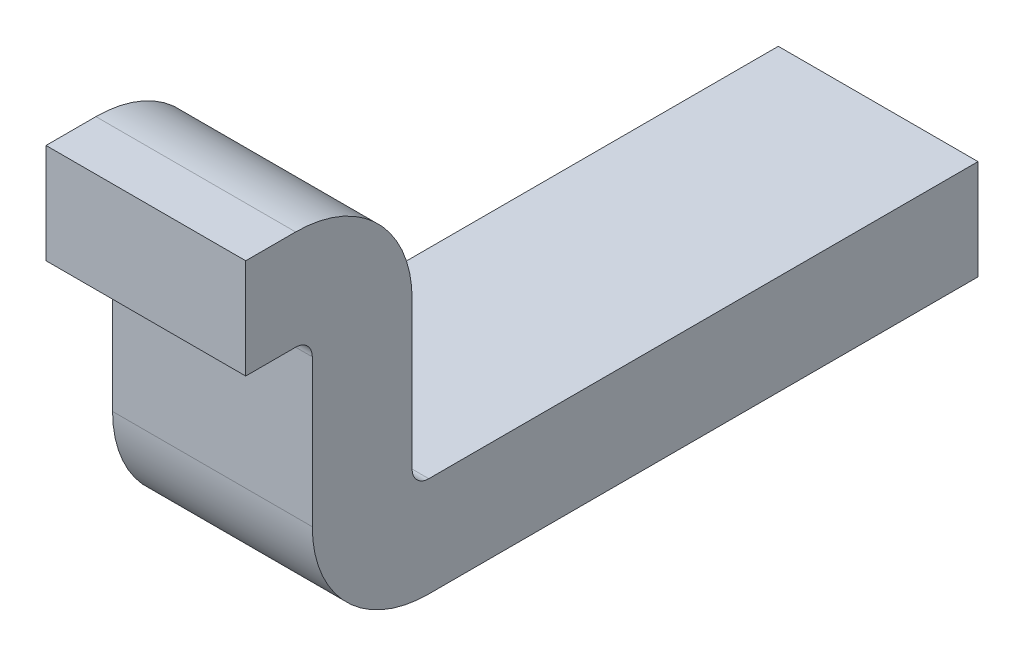
ISO-10303-21;
HEADER;
FILE_DESCRIPTION(('STEP AP214'),'2;1');
FILE_NAME('part.step','',(''),(''),'','','');
FILE_SCHEMA(('AUTOMOTIVE_DESIGN { 1 0 10303 214 1 1 1 1 }'));
ENDSEC;
DATA;
#1=APPLICATION_CONTEXT('core data for automotive mechanical design processes');
#2=APPLICATION_PROTOCOL_DEFINITION('international standard','automotive_design',2000,#1);
#3=PRODUCT_CONTEXT('',#1,'mechanical');
#4=PRODUCT('Part','Part','',(#3));
#5=PRODUCT_RELATED_PRODUCT_CATEGORY('part','',(#4));
#6=PRODUCT_DEFINITION_FORMATION('','',#4);
#7=PRODUCT_DEFINITION_CONTEXT('part definition',#1,'design');
#8=PRODUCT_DEFINITION('design','',#6,#7);
#9=PRODUCT_DEFINITION_SHAPE('','',#8);
#10=(LENGTH_UNIT() NAMED_UNIT(*) SI_UNIT(.MILLI.,.METRE.));
#11=(NAMED_UNIT(*) PLANE_ANGLE_UNIT() SI_UNIT($,.RADIAN.));
#12=(NAMED_UNIT(*) SI_UNIT($,.STERADIAN.) SOLID_ANGLE_UNIT());
#13=UNCERTAINTY_MEASURE_WITH_UNIT(LENGTH_MEASURE(1.E-05),#10,'distance_accuracy_value','');
#14=(GEOMETRIC_REPRESENTATION_CONTEXT(3) GLOBAL_UNCERTAINTY_ASSIGNED_CONTEXT((#13)) GLOBAL_UNIT_ASSIGNED_CONTEXT((#10,
#11,#12)) REPRESENTATION_CONTEXT('',''));
#15=CARTESIAN_POINT('',(0.,0.,0.));
#16=DIRECTION('',(0.,0.,1.));
#17=DIRECTION('',(1.,0.,0.));
#18=AXIS2_PLACEMENT_3D('',#15,#16,#17);
#19=CARTESIAN_POINT('',(2.04999999999999,4.55000000000001,-4.015));
#20=DIRECTION('',(0.,-1.,0.));
#21=DIRECTION('',(0.,0.,-1.));
#22=AXIS2_PLACEMENT_3D('',#19,#20,#21);
#23=PLANE('',#22);
#24=DIRECTION('',(1.,0.,0.));
#25=VECTOR('',#24,1.);
#26=CARTESIAN_POINT('',(2.04999999999999,4.55000000000001,-4.83999999999999));
#27=LINE('',#26,#25);
#28=CARTESIAN_POINT('',(2.04999999999999,4.55000000000001,-4.83999999999999));
#29=VERTEX_POINT('',#28);
#30=CARTESIAN_POINT('',(2.34999999999999,4.55000000000001,-4.83999999999999));
#31=VERTEX_POINT('',#30);
#32=EDGE_CURVE('E11',#29,#31,#27,.T.);
#33=ORIENTED_EDGE('',*,*,#32,.F.);
#34=DIRECTION('',(0.,0.,-1.));
#35=VECTOR('',#34,1.);
#36=CARTESIAN_POINT('',(2.04999999999999,4.55000000000001,-4.015));
#37=LINE('',#36,#35);
#38=CARTESIAN_POINT('',(2.04999999999999,4.55000000000001,-4.015));
#39=VERTEX_POINT('',#38);
#40=EDGE_CURVE('E24',#39,#29,#37,.T.);
#41=ORIENTED_EDGE('',*,*,#40,.F.);
#42=DIRECTION('',(-1.,0.,0.));
#43=VECTOR('',#42,1.);
#44=CARTESIAN_POINT('',(2.04999999999999,4.55000000000001,-4.015));
#45=LINE('',#44,#43);
#46=CARTESIAN_POINT('',(2.34999999999999,4.55000000000001,-4.015));
#47=VERTEX_POINT('',#46);
#48=EDGE_CURVE('E196',#47,#39,#45,.T.);
#49=ORIENTED_EDGE('',*,*,#48,.F.);
#50=DIRECTION('',(0.,0.,1.));
#51=VECTOR('',#50,1.);
#52=CARTESIAN_POINT('',(2.34999999999999,4.55000000000001,-4.015));
#53=LINE('',#52,#51);
#54=EDGE_CURVE('E193',#31,#47,#53,.T.);
#55=ORIENTED_EDGE('',*,*,#54,.F.);
#56=EDGE_LOOP('',(#33,#41,#49,#55));
#57=FACE_BOUND('',#56,.T.);
#58=ADVANCED_FACE('F17',(#57),#23,.F.);
#59=CARTESIAN_POINT('',(2.34999999999999,4.79600850144757,-3.81499999999999));
#60=DIRECTION('',(-1.,0.,0.));
#61=DIRECTION('',(0.,0.,1.));
#62=AXIS2_PLACEMENT_3D('',#59,#60,#61);
#63=PLANE('',#62);
#64=DIRECTION('',(0.,0.,1.));
#65=VECTOR('',#64,1.);
#66=CARTESIAN_POINT('',(2.34999999999999,4.82100850144757,-3.81499999999999));
#67=LINE('',#66,#65);
#68=CARTESIAN_POINT('',(2.34999999999999,4.82100850144757,-3.81499999999999));
#69=VERTEX_POINT('',#68);
#70=CARTESIAN_POINT('',(2.34999999999999,4.82100850144757,-3.73999999999999));
#71=VERTEX_POINT('',#70);
#72=EDGE_CURVE('E191',#69,#71,#67,.T.);
#73=ORIENTED_EDGE('',*,*,#72,.F.);
#74=CARTESIAN_POINT('',(2.34999999999999,4.79600850144757,-3.81499999999999));
#75=DIRECTION('',(-1.,0.,0.));
#76=DIRECTION('',(0.,0.,-1.));
#77=AXIS2_PLACEMENT_3D('',#74,#75,#76);
#78=CIRCLE('',#77,0.0249999999999998);
#79=CARTESIAN_POINT('',(2.34999999999999,4.79600850144757,-3.83999999999999));
#80=VERTEX_POINT('',#79);
#81=EDGE_CURVE('E189',#69,#80,#78,.T.);
#82=ORIENTED_EDGE('',*,*,#81,.T.);
#83=DIRECTION('',(0.,1.,0.));
#84=VECTOR('',#83,1.);
#85=CARTESIAN_POINT('',(2.34999999999999,4.79600850144757,-3.83999999999999));
#86=LINE('',#85,#84);
#87=CARTESIAN_POINT('',(2.34999999999999,4.57500000000001,-3.83999999999999));
#88=VERTEX_POINT('',#87);
#89=EDGE_CURVE('E187',#88,#80,#86,.T.);
#90=ORIENTED_EDGE('',*,*,#89,.F.);
#91=CARTESIAN_POINT('',(2.34999999999999,4.57500000000001,-4.015));
#92=DIRECTION('',(-1.,0.,0.));
#93=DIRECTION('',(0.,0.,-1.));
#94=AXIS2_PLACEMENT_3D('',#91,#92,#93);
#95=CIRCLE('',#94,0.175000000000001);
#96=CARTESIAN_POINT('',(2.34999999999999,4.40000000000001,-4.015));
#97=VERTEX_POINT('',#96);
#98=EDGE_CURVE('E126',#97,#88,#95,.T.);
#99=ORIENTED_EDGE('',*,*,#98,.F.);
#100=DIRECTION('',(0.,0.,1.));
#101=VECTOR('',#100,1.);
#102=CARTESIAN_POINT('',(2.34999999999999,4.40000000000001,-3.81499999999999));
#103=LINE('',#102,#101);
#104=CARTESIAN_POINT('',(2.34999999999999,4.40000000000001,-4.83999999999999));
#105=VERTEX_POINT('',#104);
#106=EDGE_CURVE('E183',#105,#97,#103,.T.);
#107=ORIENTED_EDGE('',*,*,#106,.F.);
#108=DIRECTION('',(0.,-1.,0.));
#109=VECTOR('',#108,1.);
#110=CARTESIAN_POINT('',(2.34999999999999,4.79600850144757,-4.83999999999999));
#111=LINE('',#110,#109);
#112=EDGE_CURVE('E181',#31,#105,#111,.T.);
#113=ORIENTED_EDGE('',*,*,#112,.F.);
#114=ORIENTED_EDGE('',*,*,#54,.T.);
#115=CARTESIAN_POINT('',(2.34999999999999,4.57500000000001,-4.015));
#116=DIRECTION('',(1.,0.,0.));
#117=DIRECTION('',(0.,0.,-1.));
#118=AXIS2_PLACEMENT_3D('',#115,#116,#117);
#119=CIRCLE('',#118,0.0250000000000007);
#120=CARTESIAN_POINT('',(2.34999999999999,4.57500000000001,-3.98999999999999));
#121=VERTEX_POINT('',#120);
#122=EDGE_CURVE('E178',#121,#47,#119,.T.);
#123=ORIENTED_EDGE('',*,*,#122,.F.);
#124=DIRECTION('',(0.,-1.,0.));
#125=VECTOR('',#124,1.);
#126=CARTESIAN_POINT('',(2.34999999999999,4.79600850144757,-3.98999999999999));
#127=LINE('',#126,#125);
#128=CARTESIAN_POINT('',(2.34999999999999,4.79600850144757,-3.98999999999999));
#129=VERTEX_POINT('',#128);
#130=EDGE_CURVE('E175',#129,#121,#127,.T.);
#131=ORIENTED_EDGE('',*,*,#130,.F.);
#132=CARTESIAN_POINT('',(2.34999999999999,4.79600850144757,-3.81499999999999));
#133=DIRECTION('',(-1.,0.,0.));
#134=DIRECTION('',(0.,0.,-1.));
#135=AXIS2_PLACEMENT_3D('',#132,#133,#134);
#136=CIRCLE('',#135,0.175000000000001);
#137=CARTESIAN_POINT('',(2.34999999999999,4.97100850144757,-3.81499999999999));
#138=VERTEX_POINT('',#137);
#139=EDGE_CURVE('E172',#138,#129,#136,.T.);
#140=ORIENTED_EDGE('',*,*,#139,.F.);
#141=DIRECTION('',(0.,0.,-1.));
#142=VECTOR('',#141,1.);
#143=CARTESIAN_POINT('',(2.34999999999999,4.97100850144757,-3.81499999999999));
#144=LINE('',#143,#142);
#145=CARTESIAN_POINT('',(2.34999999999999,4.97100850144757,-3.73999999999999));
#146=VERTEX_POINT('',#145);
#147=EDGE_CURVE('E169',#146,#138,#144,.T.);
#148=ORIENTED_EDGE('',*,*,#147,.F.);
#149=DIRECTION('',(0.,1.,0.));
#150=VECTOR('',#149,1.);
#151=CARTESIAN_POINT('',(2.34999999999999,4.79600850144757,-3.73999999999999));
#152=LINE('',#151,#150);
#153=EDGE_CURVE('E166',#71,#146,#152,.T.);
#154=ORIENTED_EDGE('',*,*,#153,.F.);
#155=EDGE_LOOP('',(#73,#82,#90,#99,#107,#113,#114,#123,#131,#140,#148,#154));
#156=FACE_BOUND('',#155,.T.);
#157=ADVANCED_FACE('F204',(#156),#63,.F.);
#158=CARTESIAN_POINT('',(2.04999999999999,4.55000000000001,-4.83999999999999));
#159=DIRECTION('',(0.,0.,1.));
#160=DIRECTION('',(1.,0.,0.));
#161=AXIS2_PLACEMENT_3D('',#158,#159,#160);
#162=PLANE('',#161);
#163=DIRECTION('',(1.,0.,0.));
#164=VECTOR('',#163,1.);
#165=CARTESIAN_POINT('',(2.04999999999999,4.40000000000001,-4.83999999999999));
#166=LINE('',#165,#164);
#167=CARTESIAN_POINT('',(2.04999999999999,4.40000000000001,-4.83999999999999));
#168=VERTEX_POINT('',#167);
#169=EDGE_CURVE('E163',#168,#105,#166,.T.);
#170=ORIENTED_EDGE('',*,*,#169,.F.);
#171=DIRECTION('',(0.,-1.,0.));
#172=VECTOR('',#171,1.);
#173=CARTESIAN_POINT('',(2.04999999999999,4.55000000000001,-4.83999999999999));
#174=LINE('',#173,#172);
#175=EDGE_CURVE('E161',#29,#168,#174,.T.);
#176=ORIENTED_EDGE('',*,*,#175,.F.);
#177=ORIENTED_EDGE('',*,*,#32,.T.);
#178=ORIENTED_EDGE('',*,*,#112,.T.);
#179=EDGE_LOOP('',(#170,#176,#177,#178));
#180=FACE_BOUND('',#179,.T.);
#181=ADVANCED_FACE('F199',(#180),#162,.F.);
#182=CARTESIAN_POINT('',(2.04999999999999,4.79600850144757,-3.81499999999999));
#183=DIRECTION('',(-1.,0.,0.));
#184=DIRECTION('',(0.,0.,1.));
#185=AXIS2_PLACEMENT_3D('',#182,#183,#184);
#186=PLANE('',#185);
#187=CARTESIAN_POINT('',(2.04999999999999,4.79600850144757,-3.81499999999999));
#188=DIRECTION('',(1.,0.,0.));
#189=DIRECTION('',(0.,0.,-1.));
#190=AXIS2_PLACEMENT_3D('',#187,#188,#189);
#191=CIRCLE('',#190,0.0249999999999998);
#192=CARTESIAN_POINT('',(2.04999999999999,4.79600850144757,-3.83999999999999));
#193=VERTEX_POINT('',#192);
#194=CARTESIAN_POINT('',(2.04999999999999,4.82100850144757,-3.81499999999999));
#195=VERTEX_POINT('',#194);
#196=EDGE_CURVE('E159',#193,#195,#191,.T.);
#197=ORIENTED_EDGE('',*,*,#196,.T.);
#198=DIRECTION('',(0.,0.,1.));
#199=VECTOR('',#198,1.);
#200=CARTESIAN_POINT('',(2.04999999999999,4.82100850144757,-3.81499999999999));
#201=LINE('',#200,#199);
#202=CARTESIAN_POINT('',(2.04999999999999,4.82100850144757,-3.73999999999999));
#203=VERTEX_POINT('',#202);
#204=EDGE_CURVE('E157',#195,#203,#201,.T.);
#205=ORIENTED_EDGE('',*,*,#204,.T.);
#206=DIRECTION('',(0.,1.,0.));
#207=VECTOR('',#206,1.);
#208=CARTESIAN_POINT('',(2.04999999999999,4.79600850144757,-3.73999999999999));
#209=LINE('',#208,#207);
#210=CARTESIAN_POINT('',(2.04999999999999,4.97100850144757,-3.73999999999999));
#211=VERTEX_POINT('',#210);
#212=EDGE_CURVE('E155',#203,#211,#209,.T.);
#213=ORIENTED_EDGE('',*,*,#212,.T.);
#214=DIRECTION('',(0.,0.,-1.));
#215=VECTOR('',#214,1.);
#216=CARTESIAN_POINT('',(2.04999999999999,4.97100850144757,-3.81499999999999));
#217=LINE('',#216,#215);
#218=CARTESIAN_POINT('',(2.04999999999999,4.97100850144757,-3.81499999999999));
#219=VERTEX_POINT('',#218);
#220=EDGE_CURVE('E153',#211,#219,#217,.T.);
#221=ORIENTED_EDGE('',*,*,#220,.T.);
#222=CARTESIAN_POINT('',(2.04999999999999,4.79600850144757,-3.81499999999999));
#223=DIRECTION('',(-1.,0.,0.));
#224=DIRECTION('',(0.,0.,-1.));
#225=AXIS2_PLACEMENT_3D('',#222,#223,#224);
#226=CIRCLE('',#225,0.175000000000001);
#227=CARTESIAN_POINT('',(2.04999999999999,4.79600850144757,-3.98999999999999));
#228=VERTEX_POINT('',#227);
#229=EDGE_CURVE('E151',#219,#228,#226,.T.);
#230=ORIENTED_EDGE('',*,*,#229,.T.);
#231=DIRECTION('',(0.,-1.,0.));
#232=VECTOR('',#231,1.);
#233=CARTESIAN_POINT('',(2.04999999999999,4.79600850144757,-3.98999999999999));
#234=LINE('',#233,#232);
#235=CARTESIAN_POINT('',(2.04999999999999,4.57500000000001,-3.98999999999999));
#236=VERTEX_POINT('',#235);
#237=EDGE_CURVE('E149',#228,#236,#234,.T.);
#238=ORIENTED_EDGE('',*,*,#237,.T.);
#239=CARTESIAN_POINT('',(2.04999999999999,4.57500000000001,-4.015));
#240=DIRECTION('',(1.,0.,0.));
#241=DIRECTION('',(0.,0.,-1.));
#242=AXIS2_PLACEMENT_3D('',#239,#240,#241);
#243=CIRCLE('',#242,0.0250000000000007);
#244=EDGE_CURVE('E146',#236,#39,#243,.T.);
#245=ORIENTED_EDGE('',*,*,#244,.T.);
#246=ORIENTED_EDGE('',*,*,#40,.T.);
#247=ORIENTED_EDGE('',*,*,#175,.T.);
#248=DIRECTION('',(0.,0.,1.));
#249=VECTOR('',#248,1.);
#250=CARTESIAN_POINT('',(2.04999999999999,4.40000000000001,-3.81499999999999));
#251=LINE('',#250,#249);
#252=CARTESIAN_POINT('',(2.04999999999999,4.40000000000001,-4.015));
#253=VERTEX_POINT('',#252);
#254=EDGE_CURVE('E109',#168,#253,#251,.T.);
#255=ORIENTED_EDGE('',*,*,#254,.T.);
#256=CARTESIAN_POINT('',(2.04999999999999,4.57500000000001,-4.015));
#257=DIRECTION('',(-1.,0.,0.));
#258=DIRECTION('',(0.,0.,-1.));
#259=AXIS2_PLACEMENT_3D('',#256,#257,#258);
#260=CIRCLE('',#259,0.175000000000001);
#261=CARTESIAN_POINT('',(2.04999999999999,4.57500000000001,-3.83999999999999));
#262=VERTEX_POINT('',#261);
#263=EDGE_CURVE('E102',#253,#262,#260,.T.);
#264=ORIENTED_EDGE('',*,*,#263,.T.);
#265=DIRECTION('',(0.,1.,0.));
#266=VECTOR('',#265,1.);
#267=CARTESIAN_POINT('',(2.04999999999999,4.79600850144757,-3.83999999999999));
#268=LINE('',#267,#266);
#269=EDGE_CURVE('E105',#262,#193,#268,.T.);
#270=ORIENTED_EDGE('',*,*,#269,.T.);
#271=EDGE_LOOP('',(#197,#205,#213,#221,#230,#238,#245,#246,#247,#255,#264,#270));
#272=FACE_BOUND('',#271,.T.);
#273=ADVANCED_FACE('F104',(#272),#186,.T.);
#274=CARTESIAN_POINT('',(2.04999999999999,4.57500000000001,-4.015));
#275=DIRECTION('',(1.,0.,0.));
#276=DIRECTION('',(0.,0.,-1.));
#277=AXIS2_PLACEMENT_3D('',#274,#275,#276);
#278=CYLINDRICAL_SURFACE('',#277,0.0250000000000007);
#279=ORIENTED_EDGE('',*,*,#48,.T.);
#280=ORIENTED_EDGE('',*,*,#244,.F.);
#281=DIRECTION('',(-1.,0.,0.));
#282=VECTOR('',#281,1.);
#283=CARTESIAN_POINT('',(2.04999999999999,4.57500000000001,-3.98999999999999));
#284=LINE('',#283,#282);
#285=EDGE_CURVE('E122',#121,#236,#284,.T.);
#286=ORIENTED_EDGE('',*,*,#285,.F.);
#287=ORIENTED_EDGE('',*,*,#122,.T.);
#288=EDGE_LOOP('',(#279,#280,#286,#287));
#289=FACE_BOUND('',#288,.T.);
#290=ADVANCED_FACE('F235',(#289),#278,.F.);
#291=CARTESIAN_POINT('',(2.04999999999999,4.82100850144757,-3.73999999999999));
#292=DIRECTION('',(0.,0.,-1.));
#293=DIRECTION('',(-1.,0.,0.));
#294=AXIS2_PLACEMENT_3D('',#291,#292,#293);
#295=PLANE('',#294);
#296=DIRECTION('',(1.,0.,0.));
#297=VECTOR('',#296,1.);
#298=CARTESIAN_POINT('',(2.04999999999999,4.97100850144757,-3.73999999999999));
#299=LINE('',#298,#297);
#300=EDGE_CURVE('E140',#211,#146,#299,.T.);
#301=ORIENTED_EDGE('',*,*,#300,.F.);
#302=ORIENTED_EDGE('',*,*,#212,.F.);
#303=DIRECTION('',(-1.,0.,0.));
#304=VECTOR('',#303,1.);
#305=CARTESIAN_POINT('',(2.04999999999999,4.82100850144757,-3.73999999999999));
#306=LINE('',#305,#304);
#307=EDGE_CURVE('E137',#71,#203,#306,.T.);
#308=ORIENTED_EDGE('',*,*,#307,.F.);
#309=ORIENTED_EDGE('',*,*,#153,.T.);
#310=EDGE_LOOP('',(#301,#302,#308,#309));
#311=FACE_BOUND('',#310,.T.);
#312=ADVANCED_FACE('F217',(#311),#295,.F.);
#313=CARTESIAN_POINT('',(2.04999999999999,4.82100850144757,-3.81499999999999));
#314=DIRECTION('',(0.,1.,0.));
#315=DIRECTION('',(0.,0.,1.));
#316=AXIS2_PLACEMENT_3D('',#313,#314,#315);
#317=PLANE('',#316);
#318=ORIENTED_EDGE('',*,*,#307,.T.);
#319=ORIENTED_EDGE('',*,*,#204,.F.);
#320=DIRECTION('',(-1.,0.,0.));
#321=VECTOR('',#320,1.);
#322=CARTESIAN_POINT('',(2.04999999999999,4.82100850144757,-3.81499999999999));
#323=LINE('',#322,#321);
#324=EDGE_CURVE('E129',#69,#195,#323,.T.);
#325=ORIENTED_EDGE('',*,*,#324,.F.);
#326=ORIENTED_EDGE('',*,*,#72,.T.);
#327=EDGE_LOOP('',(#318,#319,#325,#326));
#328=FACE_BOUND('',#327,.T.);
#329=ADVANCED_FACE('F212',(#328),#317,.F.);
#330=CARTESIAN_POINT('',(2.04999999999999,4.57500000000001,-3.83999999999999));
#331=DIRECTION('',(0.,0.,-1.));
#332=DIRECTION('',(-1.,0.,0.));
#333=AXIS2_PLACEMENT_3D('',#330,#331,#332);
#334=PLANE('',#333);
#335=DIRECTION('',(1.,0.,0.));
#336=VECTOR('',#335,1.);
#337=CARTESIAN_POINT('',(2.04999999999999,4.79600850144757,-3.83999999999999));
#338=LINE('',#337,#336);
#339=EDGE_CURVE('E121',#193,#80,#338,.T.);
#340=ORIENTED_EDGE('',*,*,#339,.F.);
#341=ORIENTED_EDGE('',*,*,#269,.F.);
#342=DIRECTION('',(-1.,0.,0.));
#343=VECTOR('',#342,1.);
#344=CARTESIAN_POINT('',(2.04999999999999,4.57500000000001,-3.83999999999999));
#345=LINE('',#344,#343);
#346=EDGE_CURVE('E119',#88,#262,#345,.T.);
#347=ORIENTED_EDGE('',*,*,#346,.F.);
#348=ORIENTED_EDGE('',*,*,#89,.T.);
#349=EDGE_LOOP('',(#340,#341,#347,#348));
#350=FACE_BOUND('',#349,.T.);
#351=ADVANCED_FACE('F117',(#350),#334,.F.);
#352=CARTESIAN_POINT('',(2.04999999999999,4.57500000000001,-4.015));
#353=DIRECTION('',(1.,0.,0.));
#354=DIRECTION('',(0.,0.,-1.));
#355=AXIS2_PLACEMENT_3D('',#352,#353,#354);
#356=CYLINDRICAL_SURFACE('',#355,0.175000000000001);
#357=ORIENTED_EDGE('',*,*,#263,.F.);
#358=DIRECTION('',(1.,0.,0.));
#359=VECTOR('',#358,1.);
#360=CARTESIAN_POINT('',(2.04999999999999,4.40000000000001,-4.015));
#361=LINE('',#360,#359);
#362=EDGE_CURVE('E127',#253,#97,#361,.T.);
#363=ORIENTED_EDGE('',*,*,#362,.T.);
#364=ORIENTED_EDGE('',*,*,#98,.T.);
#365=ORIENTED_EDGE('',*,*,#346,.T.);
#366=EDGE_LOOP('',(#357,#363,#364,#365));
#367=FACE_BOUND('',#366,.T.);
#368=ADVANCED_FACE('F125',(#367),#356,.T.);
#369=CARTESIAN_POINT('',(2.04999999999999,4.40000000000001,-4.83999999999999));
#370=DIRECTION('',(0.,1.,0.));
#371=DIRECTION('',(0.,0.,1.));
#372=AXIS2_PLACEMENT_3D('',#369,#370,#371);
#373=PLANE('',#372);
#374=ORIENTED_EDGE('',*,*,#362,.F.);
#375=ORIENTED_EDGE('',*,*,#254,.F.);
#376=ORIENTED_EDGE('',*,*,#169,.T.);
#377=ORIENTED_EDGE('',*,*,#106,.T.);
#378=EDGE_LOOP('',(#374,#375,#376,#377));
#379=FACE_BOUND('',#378,.T.);
#380=ADVANCED_FACE('F202',(#379),#373,.F.);
#381=CARTESIAN_POINT('',(2.04999999999999,4.79600850144757,-3.98999999999999));
#382=DIRECTION('',(0.,0.,1.));
#383=DIRECTION('',(0.,-1.,0.));
#384=AXIS2_PLACEMENT_3D('',#381,#382,#383);
#385=PLANE('',#384);
#386=ORIENTED_EDGE('',*,*,#285,.T.);
#387=ORIENTED_EDGE('',*,*,#237,.F.);
#388=DIRECTION('',(-1.,0.,0.));
#389=VECTOR('',#388,1.);
#390=CARTESIAN_POINT('',(2.04999999999999,4.79600850144757,-3.98999999999999));
#391=LINE('',#390,#389);
#392=EDGE_CURVE('E131',#129,#228,#391,.T.);
#393=ORIENTED_EDGE('',*,*,#392,.F.);
#394=ORIENTED_EDGE('',*,*,#130,.T.);
#395=EDGE_LOOP('',(#386,#387,#393,#394));
#396=FACE_BOUND('',#395,.T.);
#397=ADVANCED_FACE('F232',(#396),#385,.F.);
#398=CARTESIAN_POINT('',(2.04999999999999,4.79600850144757,-3.81499999999999));
#399=DIRECTION('',(1.,0.,0.));
#400=DIRECTION('',(0.,0.,-1.));
#401=AXIS2_PLACEMENT_3D('',#398,#399,#400);
#402=CYLINDRICAL_SURFACE('',#401,0.175000000000001);
#403=ORIENTED_EDGE('',*,*,#229,.F.);
#404=DIRECTION('',(1.,0.,0.));
#405=VECTOR('',#404,1.);
#406=CARTESIAN_POINT('',(2.04999999999999,4.97100850144757,-3.81499999999999));
#407=LINE('',#406,#405);
#408=EDGE_CURVE('E224',#219,#138,#407,.T.);
#409=ORIENTED_EDGE('',*,*,#408,.T.);
#410=ORIENTED_EDGE('',*,*,#139,.T.);
#411=ORIENTED_EDGE('',*,*,#392,.T.);
#412=EDGE_LOOP('',(#403,#409,#410,#411));
#413=FACE_BOUND('',#412,.T.);
#414=ADVANCED_FACE('F229',(#413),#402,.T.);
#415=CARTESIAN_POINT('',(2.04999999999999,4.97100850144757,-3.73999999999999));
#416=DIRECTION('',(0.,-1.,0.));
#417=DIRECTION('',(0.,0.,-1.));
#418=AXIS2_PLACEMENT_3D('',#415,#416,#417);
#419=PLANE('',#418);
#420=ORIENTED_EDGE('',*,*,#408,.F.);
#421=ORIENTED_EDGE('',*,*,#220,.F.);
#422=ORIENTED_EDGE('',*,*,#300,.T.);
#423=ORIENTED_EDGE('',*,*,#147,.T.);
#424=EDGE_LOOP('',(#420,#421,#422,#423));
#425=FACE_BOUND('',#424,.T.);
#426=ADVANCED_FACE('F222',(#425),#419,.F.);
#427=CARTESIAN_POINT('',(2.04999999999999,4.79600850144757,-3.81499999999999));
#428=DIRECTION('',(1.,0.,0.));
#429=DIRECTION('',(0.,0.,-1.));
#430=AXIS2_PLACEMENT_3D('',#427,#428,#429);
#431=CYLINDRICAL_SURFACE('',#430,0.0249999999999998);
#432=ORIENTED_EDGE('',*,*,#324,.T.);
#433=ORIENTED_EDGE('',*,*,#196,.F.);
#434=ORIENTED_EDGE('',*,*,#339,.T.);
#435=ORIENTED_EDGE('',*,*,#81,.F.);
#436=EDGE_LOOP('',(#432,#433,#434,#435));
#437=FACE_BOUND('',#436,.T.);
#438=ADVANCED_FACE('F207',(#437),#431,.F.);
#439=CLOSED_SHELL('',(#58,#157,#181,#273,#290,#312,#329,#351,#368,#380,#397,#414,#426,#438));
#440=MANIFOLD_SOLID_BREP('B1',#439);
#441=ADVANCED_BREP_SHAPE_REPRESENTATION('',(#18,#440),#14);
#442=SHAPE_DEFINITION_REPRESENTATION(#9,#441);
ENDSEC;
END-ISO-10303-21;
